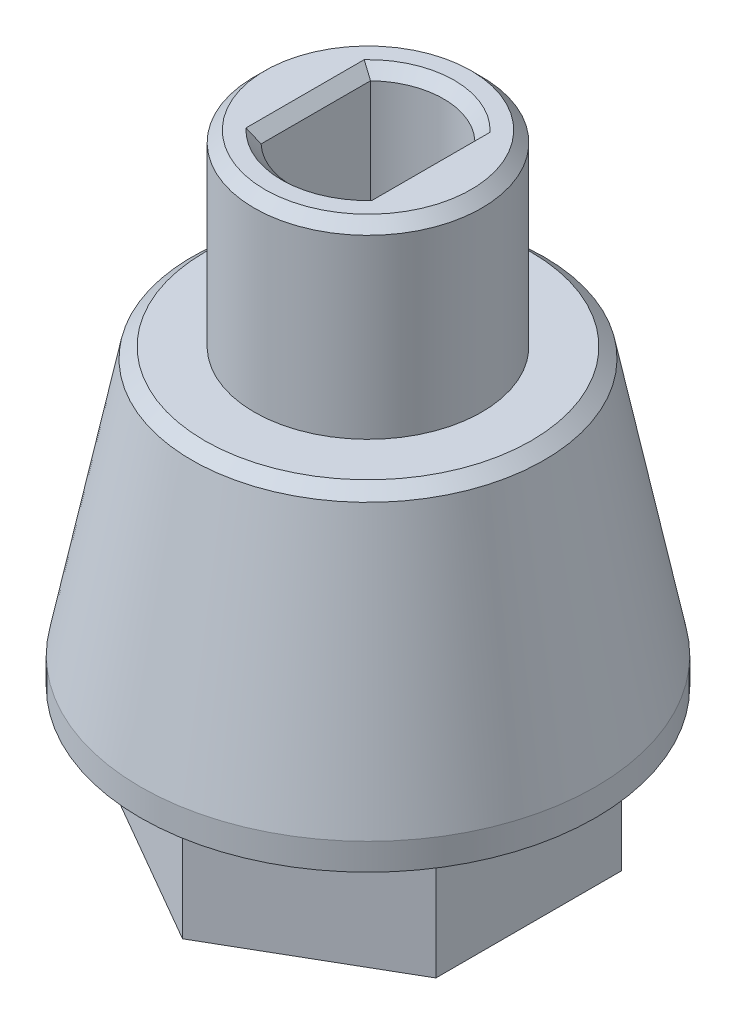
ISO-10303-21;
HEADER;
FILE_DESCRIPTION(('STEP AP214'),'2;1');
FILE_NAME('part.step','',(''),(''),'','','');
FILE_SCHEMA(('AUTOMOTIVE_DESIGN { 1 0 10303 214 1 1 1 1 }'));
ENDSEC;
DATA;
#1=APPLICATION_CONTEXT('core data for automotive mechanical design processes');
#2=APPLICATION_PROTOCOL_DEFINITION('international standard','automotive_design',2000,#1);
#3=PRODUCT_CONTEXT('',#1,'mechanical');
#4=PRODUCT('Part','Part','',(#3));
#5=PRODUCT_RELATED_PRODUCT_CATEGORY('part','',(#4));
#6=PRODUCT_DEFINITION_FORMATION('','',#4);
#7=PRODUCT_DEFINITION_CONTEXT('part definition',#1,'design');
#8=PRODUCT_DEFINITION('design','',#6,#7);
#9=PRODUCT_DEFINITION_SHAPE('','',#8);
#10=(LENGTH_UNIT() NAMED_UNIT(*) SI_UNIT(.MILLI.,.METRE.));
#11=(NAMED_UNIT(*) PLANE_ANGLE_UNIT() SI_UNIT($,.RADIAN.));
#12=(NAMED_UNIT(*) SI_UNIT($,.STERADIAN.) SOLID_ANGLE_UNIT());
#13=UNCERTAINTY_MEASURE_WITH_UNIT(LENGTH_MEASURE(1.E-05),#10,'distance_accuracy_value','');
#14=(GEOMETRIC_REPRESENTATION_CONTEXT(3) GLOBAL_UNCERTAINTY_ASSIGNED_CONTEXT((#13)) GLOBAL_UNIT_ASSIGNED_CONTEXT((#10,
#11,#12)) REPRESENTATION_CONTEXT('',''));
#15=CARTESIAN_POINT('',(0.,0.,0.));
#16=DIRECTION('',(0.,0.,1.));
#17=DIRECTION('',(1.,0.,0.));
#18=AXIS2_PLACEMENT_3D('',#15,#16,#17);
#19=CARTESIAN_POINT('',(0.,15.7,0.));
#20=DIRECTION('',(0.,1.,0.));
#21=DIRECTION('',(0.,0.,1.));
#22=AXIS2_PLACEMENT_3D('',#19,#20,#21);
#23=PLANE('',#22);
#24=CARTESIAN_POINT('',(0.,15.7,0.));
#25=DIRECTION('',(0.,1.,0.));
#26=DIRECTION('',(0.,0.,1.));
#27=AXIS2_PLACEMENT_3D('',#24,#25,#26);
#28=CIRCLE('',#27,6.09999999999999);
#29=CARTESIAN_POINT('',(0.,15.7,-6.09999999999999));
#30=VERTEX_POINT('',#29);
#31=EDGE_CURVE('E273',#30,#30,#28,.T.);
#32=ORIENTED_EDGE('',*,*,#31,.T.);
#33=EDGE_LOOP('',(#32));
#34=FACE_BOUND('',#33,.T.);
#35=CARTESIAN_POINT('',(0.,15.7,0.));
#36=DIRECTION('',(0.,1.,0.));
#37=DIRECTION('',(0.,0.,1.));
#38=AXIS2_PLACEMENT_3D('',#35,#36,#37);
#39=CIRCLE('',#38,4.25);
#40=CARTESIAN_POINT('',(0.,15.7,4.25));
#41=VERTEX_POINT('',#40);
#42=EDGE_CURVE('E159',#41,#41,#39,.T.);
#43=ORIENTED_EDGE('',*,*,#42,.F.);
#44=EDGE_LOOP('',(#43));
#45=FACE_BOUND('',#44,.T.);
#46=ADVANCED_FACE('F49',(#34,#45),#23,.T.);
#47=CARTESIAN_POINT('',(-6.00000000000002,4.7,-3.46410161513769));
#48=DIRECTION('',(0.500000000000005,0.,0.866025403784436));
#49=DIRECTION('',(0.866025403784436,0.,-0.500000000000005));
#50=AXIS2_PLACEMENT_3D('',#47,#48,#49);
#51=PLANE('',#50);
#52=DIRECTION('',(-0.866025403784436,0.,0.500000000000005));
#53=VECTOR('',#52,1.);
#54=CARTESIAN_POINT('',(-6.00000000000002,0.,-3.46410161513769));
#55=LINE('',#54,#53);
#56=CARTESIAN_POINT('',(0.,0.,-6.9282032302755));
#57=VERTEX_POINT('',#56);
#58=CARTESIAN_POINT('',(-6.00000000000002,0.,-3.46410161513769));
#59=VERTEX_POINT('',#58);
#60=EDGE_CURVE('E232',#57,#59,#55,.T.);
#61=ORIENTED_EDGE('',*,*,#60,.T.);
#62=DIRECTION('',(0.,-1.,0.));
#63=VECTOR('',#62,1.);
#64=CARTESIAN_POINT('',(-6.00000000000002,4.7,-3.46410161513769));
#65=LINE('',#64,#63);
#66=CARTESIAN_POINT('',(-6.00000000000002,4.7,-3.46410161513769));
#67=VERTEX_POINT('',#66);
#68=EDGE_CURVE('E269',#67,#59,#65,.T.);
#69=ORIENTED_EDGE('',*,*,#68,.F.);
#70=DIRECTION('',(-0.866025403784436,0.,0.500000000000005));
#71=VECTOR('',#70,1.);
#72=CARTESIAN_POINT('',(-6.00000000000002,4.7,-3.46410161513769));
#73=LINE('',#72,#71);
#74=CARTESIAN_POINT('',(0.,4.7,-6.9282032302755));
#75=VERTEX_POINT('',#74);
#76=EDGE_CURVE('E206',#75,#67,#73,.T.);
#77=ORIENTED_EDGE('',*,*,#76,.F.);
#78=DIRECTION('',(0.,-1.,0.));
#79=VECTOR('',#78,1.);
#80=CARTESIAN_POINT('',(0.,4.7,-6.9282032302755));
#81=LINE('',#80,#79);
#82=EDGE_CURVE('E231',#75,#57,#81,.T.);
#83=ORIENTED_EDGE('',*,*,#82,.T.);
#84=EDGE_LOOP('',(#61,#69,#77,#83));
#85=FACE_BOUND('',#84,.T.);
#86=ADVANCED_FACE('F366',(#85),#51,.F.);
#87=CARTESIAN_POINT('',(-5.99999999999997,4.7,3.46410161513778));
#88=DIRECTION('',(1.,0.,0.));
#89=DIRECTION('',(0.,0.,-1.));
#90=AXIS2_PLACEMENT_3D('',#87,#88,#89);
#91=PLANE('',#90);
#92=DIRECTION('',(0.,0.,1.));
#93=VECTOR('',#92,1.);
#94=CARTESIAN_POINT('',(-5.99999999999997,0.,3.46410161513778));
#95=LINE('',#94,#93);
#96=CARTESIAN_POINT('',(-5.99999999999997,0.,3.46410161513778));
#97=VERTEX_POINT('',#96);
#98=EDGE_CURVE('E236',#59,#97,#95,.T.);
#99=ORIENTED_EDGE('',*,*,#98,.T.);
#100=DIRECTION('',(0.,-1.,0.));
#101=VECTOR('',#100,1.);
#102=CARTESIAN_POINT('',(-5.99999999999997,4.7,3.46410161513778));
#103=LINE('',#102,#101);
#104=CARTESIAN_POINT('',(-5.99999999999997,4.7,3.46410161513778));
#105=VERTEX_POINT('',#104);
#106=EDGE_CURVE('E265',#105,#97,#103,.T.);
#107=ORIENTED_EDGE('',*,*,#106,.F.);
#108=DIRECTION('',(0.,0.,1.));
#109=VECTOR('',#108,1.);
#110=CARTESIAN_POINT('',(-5.99999999999997,4.7,3.46410161513778));
#111=LINE('',#110,#109);
#112=EDGE_CURVE('E210',#67,#105,#111,.T.);
#113=ORIENTED_EDGE('',*,*,#112,.F.);
#114=ORIENTED_EDGE('',*,*,#68,.T.);
#115=EDGE_LOOP('',(#99,#107,#113,#114));
#116=FACE_BOUND('',#115,.T.);
#117=ADVANCED_FACE('F372',(#116),#91,.F.);
#118=CARTESIAN_POINT('',(0.,4.7,6.9282032302755));
#119=DIRECTION('',(0.499999999999997,0.,-0.86602540378444));
#120=DIRECTION('',(-0.86602540378444,0.,-0.499999999999997));
#121=AXIS2_PLACEMENT_3D('',#118,#119,#120);
#122=PLANE('',#121);
#123=DIRECTION('',(0.86602540378444,0.,0.499999999999997));
#124=VECTOR('',#123,1.);
#125=CARTESIAN_POINT('',(0.,0.,6.9282032302755));
#126=LINE('',#125,#124);
#127=CARTESIAN_POINT('',(0.,0.,6.9282032302755));
#128=VERTEX_POINT('',#127);
#129=EDGE_CURVE('E239',#97,#128,#126,.T.);
#130=ORIENTED_EDGE('',*,*,#129,.T.);
#131=DIRECTION('',(0.,-1.,0.));
#132=VECTOR('',#131,1.);
#133=CARTESIAN_POINT('',(0.,4.7,6.9282032302755));
#134=LINE('',#133,#132);
#135=CARTESIAN_POINT('',(0.,4.7,6.9282032302755));
#136=VERTEX_POINT('',#135);
#137=EDGE_CURVE('E261',#136,#128,#134,.T.);
#138=ORIENTED_EDGE('',*,*,#137,.F.);
#139=DIRECTION('',(0.86602540378444,0.,0.499999999999997));
#140=VECTOR('',#139,1.);
#141=CARTESIAN_POINT('',(0.,4.7,6.9282032302755));
#142=LINE('',#141,#140);
#143=EDGE_CURVE('E215',#105,#136,#142,.T.);
#144=ORIENTED_EDGE('',*,*,#143,.F.);
#145=ORIENTED_EDGE('',*,*,#106,.T.);
#146=EDGE_LOOP('',(#130,#138,#144,#145));
#147=FACE_BOUND('',#146,.T.);
#148=ADVANCED_FACE('F408',(#147),#122,.F.);
#149=CARTESIAN_POINT('',(6.00000000000003,4.7,3.46410161513769));
#150=DIRECTION('',(-0.500000000000005,0.,-0.866025403784436));
#151=DIRECTION('',(-0.866025403784436,0.,0.500000000000005));
#152=AXIS2_PLACEMENT_3D('',#149,#150,#151);
#153=PLANE('',#152);
#154=DIRECTION('',(0.866025403784436,0.,-0.500000000000005));
#155=VECTOR('',#154,1.);
#156=CARTESIAN_POINT('',(6.00000000000003,0.,3.46410161513769));
#157=LINE('',#156,#155);
#158=CARTESIAN_POINT('',(6.00000000000003,0.,3.46410161513769));
#159=VERTEX_POINT('',#158);
#160=EDGE_CURVE('E242',#128,#159,#157,.T.);
#161=ORIENTED_EDGE('',*,*,#160,.T.);
#162=DIRECTION('',(0.,-1.,0.));
#163=VECTOR('',#162,1.);
#164=CARTESIAN_POINT('',(6.00000000000003,4.7,3.46410161513769));
#165=LINE('',#164,#163);
#166=CARTESIAN_POINT('',(6.00000000000003,4.7,3.46410161513769));
#167=VERTEX_POINT('',#166);
#168=EDGE_CURVE('E257',#167,#159,#165,.T.);
#169=ORIENTED_EDGE('',*,*,#168,.F.);
#170=DIRECTION('',(0.866025403784436,0.,-0.500000000000005));
#171=VECTOR('',#170,1.);
#172=CARTESIAN_POINT('',(6.00000000000003,4.7,3.46410161513769));
#173=LINE('',#172,#171);
#174=EDGE_CURVE('E219',#136,#167,#173,.T.);
#175=ORIENTED_EDGE('',*,*,#174,.F.);
#176=ORIENTED_EDGE('',*,*,#137,.T.);
#177=EDGE_LOOP('',(#161,#169,#175,#176));
#178=FACE_BOUND('',#177,.T.);
#179=ADVANCED_FACE('F404',(#178),#153,.F.);
#180=CARTESIAN_POINT('',(5.99999999999997,4.7,-3.46410161513778));
#181=DIRECTION('',(-1.,0.,0.));
#182=DIRECTION('',(0.,0.,1.));
#183=AXIS2_PLACEMENT_3D('',#180,#181,#182);
#184=PLANE('',#183);
#185=DIRECTION('',(0.,0.,-1.));
#186=VECTOR('',#185,1.);
#187=CARTESIAN_POINT('',(5.99999999999997,0.,-3.46410161513778));
#188=LINE('',#187,#186);
#189=CARTESIAN_POINT('',(5.99999999999997,0.,-3.46410161513778));
#190=VERTEX_POINT('',#189);
#191=EDGE_CURVE('E245',#159,#190,#188,.T.);
#192=ORIENTED_EDGE('',*,*,#191,.T.);
#193=DIRECTION('',(0.,-1.,0.));
#194=VECTOR('',#193,1.);
#195=CARTESIAN_POINT('',(5.99999999999997,4.7,-3.46410161513778));
#196=LINE('',#195,#194);
#197=CARTESIAN_POINT('',(5.99999999999997,4.7,-3.46410161513778));
#198=VERTEX_POINT('',#197);
#199=EDGE_CURVE('E253',#198,#190,#196,.T.);
#200=ORIENTED_EDGE('',*,*,#199,.F.);
#201=DIRECTION('',(0.,0.,-1.));
#202=VECTOR('',#201,1.);
#203=CARTESIAN_POINT('',(5.99999999999997,4.7,-3.46410161513778));
#204=LINE('',#203,#202);
#205=EDGE_CURVE('E223',#167,#198,#204,.T.);
#206=ORIENTED_EDGE('',*,*,#205,.F.);
#207=ORIENTED_EDGE('',*,*,#168,.T.);
#208=EDGE_LOOP('',(#192,#200,#206,#207));
#209=FACE_BOUND('',#208,.T.);
#210=ADVANCED_FACE('F400',(#209),#184,.F.);
#211=CARTESIAN_POINT('',(0.,4.7,-6.9282032302755));
#212=DIRECTION('',(-0.499999999999997,0.,0.86602540378444));
#213=DIRECTION('',(0.86602540378444,0.,0.499999999999997));
#214=AXIS2_PLACEMENT_3D('',#211,#212,#213);
#215=PLANE('',#214);
#216=DIRECTION('',(-0.86602540378444,0.,-0.499999999999997));
#217=VECTOR('',#216,1.);
#218=CARTESIAN_POINT('',(0.,0.,-6.9282032302755));
#219=LINE('',#218,#217);
#220=EDGE_CURVE('E211',#190,#57,#219,.T.);
#221=ORIENTED_EDGE('',*,*,#220,.T.);
#222=ORIENTED_EDGE('',*,*,#82,.F.);
#223=DIRECTION('',(-0.86602540378444,0.,-0.499999999999997));
#224=VECTOR('',#223,1.);
#225=CARTESIAN_POINT('',(0.,4.7,-6.9282032302755));
#226=LINE('',#225,#224);
#227=EDGE_CURVE('E227',#198,#75,#226,.T.);
#228=ORIENTED_EDGE('',*,*,#227,.F.);
#229=ORIENTED_EDGE('',*,*,#199,.T.);
#230=EDGE_LOOP('',(#221,#222,#228,#229));
#231=FACE_BOUND('',#230,.T.);
#232=ADVANCED_FACE('F396',(#231),#215,.F.);
#233=CARTESIAN_POINT('',(0.,0.,0.));
#234=DIRECTION('',(0.,-1.,0.));
#235=DIRECTION('',(0.,0.,-1.));
#236=AXIS2_PLACEMENT_3D('',#233,#234,#235);
#237=PLANE('',#236);
#238=CARTESIAN_POINT('',(0.,0.,0.));
#239=DIRECTION('',(0.,-1.,0.));
#240=DIRECTION('',(0.,0.,-1.));
#241=AXIS2_PLACEMENT_3D('',#238,#239,#240);
#242=CIRCLE('',#241,0.75);
#243=CARTESIAN_POINT('',(0.,0.,-0.75));
#244=VERTEX_POINT('',#243);
#245=EDGE_CURVE('E181',#244,#244,#242,.T.);
#246=ORIENTED_EDGE('',*,*,#245,.F.);
#247=EDGE_LOOP('',(#246));
#248=FACE_BOUND('',#247,.T.);
#249=ORIENTED_EDGE('',*,*,#60,.F.);
#250=ORIENTED_EDGE('',*,*,#220,.F.);
#251=ORIENTED_EDGE('',*,*,#191,.F.);
#252=ORIENTED_EDGE('',*,*,#160,.F.);
#253=ORIENTED_EDGE('',*,*,#129,.F.);
#254=ORIENTED_EDGE('',*,*,#98,.F.);
#255=EDGE_LOOP('',(#249,#250,#251,#252,#253,#254));
#256=FACE_BOUND('',#255,.T.);
#257=ADVANCED_FACE('F389',(#248,#256),#237,.T.);
#258=CARTESIAN_POINT('',(0.,4.7,0.));
#259=DIRECTION('',(0.,1.,0.));
#260=DIRECTION('',(0.,0.,1.));
#261=AXIS2_PLACEMENT_3D('',#258,#259,#260);
#262=PLANE('',#261);
#263=CARTESIAN_POINT('',(0.,4.7,0.));
#264=DIRECTION('',(0.,1.,0.));
#265=DIRECTION('',(0.,0.,1.));
#266=AXIS2_PLACEMENT_3D('',#263,#264,#265);
#267=CIRCLE('',#266,8.5);
#268=CARTESIAN_POINT('',(0.,4.7,8.5));
#269=VERTEX_POINT('',#268);
#270=EDGE_CURVE('E201',#269,#269,#267,.T.);
#271=ORIENTED_EDGE('',*,*,#270,.F.);
#272=EDGE_LOOP('',(#271));
#273=FACE_BOUND('',#272,.T.);
#274=ORIENTED_EDGE('',*,*,#227,.T.);
#275=ORIENTED_EDGE('',*,*,#76,.T.);
#276=ORIENTED_EDGE('',*,*,#112,.T.);
#277=ORIENTED_EDGE('',*,*,#143,.T.);
#278=ORIENTED_EDGE('',*,*,#174,.T.);
#279=ORIENTED_EDGE('',*,*,#205,.T.);
#280=EDGE_LOOP('',(#274,#275,#276,#277,#278,#279));
#281=FACE_BOUND('',#280,.T.);
#282=ADVANCED_FACE('F386',(#273,#281),#262,.F.);
#283=CARTESIAN_POINT('',(0.,5.7,0.));
#284=DIRECTION('',(0.,-1.,0.));
#285=DIRECTION('',(0.,0.,-1.));
#286=AXIS2_PLACEMENT_3D('',#283,#284,#285);
#287=CYLINDRICAL_SURFACE('',#286,8.5);
#288=CARTESIAN_POINT('',(0.,5.7,0.));
#289=DIRECTION('',(0.,-1.,0.));
#290=DIRECTION('',(0.,0.,-1.));
#291=AXIS2_PLACEMENT_3D('',#288,#289,#290);
#292=CIRCLE('',#291,8.5);
#293=CARTESIAN_POINT('',(0.,5.7,-8.5));
#294=VERTEX_POINT('',#293);
#295=EDGE_CURVE('E205',#294,#294,#292,.F.);
#296=ORIENTED_EDGE('',*,*,#295,.F.);
#297=EDGE_LOOP('',(#296));
#298=FACE_BOUND('',#297,.T.);
#299=ORIENTED_EDGE('',*,*,#270,.T.);
#300=EDGE_LOOP('',(#299));
#301=FACE_BOUND('',#300,.T.);
#302=ADVANCED_FACE('F384',(#298,#301),#287,.T.);
#303=CARTESIAN_POINT('',(0.,15.7,0.));
#304=DIRECTION('',(0.,-1.,0.));
#305=DIRECTION('',(0.,0.,-1.));
#306=AXIS2_PLACEMENT_3D('',#303,#304,#305);
#307=CONICAL_SURFACE('',#306,6.5,0.197395559849881);
#308=CARTESIAN_POINT('',(0.,15.3077677297236,0.));
#309=DIRECTION('',(0.,1.,0.));
#310=DIRECTION('',(0.,0.,1.));
#311=AXIS2_PLACEMENT_3D('',#308,#309,#310);
#312=CIRCLE('',#311,6.57844645405527);
#313=CARTESIAN_POINT('',(0.,15.3077677297236,-6.57844645405527));
#314=VERTEX_POINT('',#313);
#315=EDGE_CURVE('E282',#314,#314,#312,.F.);
#316=ORIENTED_EDGE('',*,*,#315,.T.);
#317=EDGE_LOOP('',(#316));
#318=FACE_BOUND('',#317,.T.);
#319=ORIENTED_EDGE('',*,*,#295,.T.);
#320=EDGE_LOOP('',(#319));
#321=FACE_BOUND('',#320,.T.);
#322=ADVANCED_FACE('F380',(#318,#321),#307,.T.);
#323=CARTESIAN_POINT('',(0.,22.7,0.));
#324=DIRECTION('',(0.,1.,0.));
#325=DIRECTION('',(0.,0.,1.));
#326=AXIS2_PLACEMENT_3D('',#323,#324,#325);
#327=PLANE('',#326);
#328=CARTESIAN_POINT('',(0.,22.7,0.));
#329=DIRECTION('',(0.,1.,0.));
#330=DIRECTION('',(0.,0.,1.));
#331=AXIS2_PLACEMENT_3D('',#328,#329,#330);
#332=CIRCLE('',#331,3.22500000000001);
#333=CARTESIAN_POINT('',(2.35000000000001,22.7,2.20864777635548));
#334=VERTEX_POINT('',#333);
#335=CARTESIAN_POINT('',(-2.35000000000001,22.7,2.20864777635548));
#336=VERTEX_POINT('',#335);
#337=EDGE_CURVE('E293',#334,#336,#332,.F.);
#338=ORIENTED_EDGE('',*,*,#337,.T.);
#339=DIRECTION('',(0.,0.,-1.));
#340=VECTOR('',#339,1.);
#341=CARTESIAN_POINT('',(-2.35000000000001,22.7,0.));
#342=LINE('',#341,#340);
#343=CARTESIAN_POINT('',(-2.35000000000001,22.7,-2.20864777635548));
#344=VERTEX_POINT('',#343);
#345=EDGE_CURVE('E302',#336,#344,#342,.T.);
#346=ORIENTED_EDGE('',*,*,#345,.T.);
#347=CARTESIAN_POINT('',(0.,22.7,0.));
#348=DIRECTION('',(0.,1.,0.));
#349=DIRECTION('',(0.,0.,1.));
#350=AXIS2_PLACEMENT_3D('',#347,#348,#349);
#351=CIRCLE('',#350,3.22500000000001);
#352=CARTESIAN_POINT('',(2.35000000000001,22.7,-2.20864777635548));
#353=VERTEX_POINT('',#352);
#354=EDGE_CURVE('E299',#344,#353,#351,.F.);
#355=ORIENTED_EDGE('',*,*,#354,.T.);
#356=DIRECTION('',(0.,0.,1.));
#357=VECTOR('',#356,1.);
#358=CARTESIAN_POINT('',(2.35000000000001,22.7,0.));
#359=LINE('',#358,#357);
#360=EDGE_CURVE('E296',#353,#334,#359,.T.);
#361=ORIENTED_EDGE('',*,*,#360,.T.);
#362=EDGE_LOOP('',(#338,#346,#355,#361));
#363=FACE_BOUND('',#362,.T.);
#364=CARTESIAN_POINT('',(0.,22.7,0.));
#365=DIRECTION('',(0.,1.,0.));
#366=DIRECTION('',(0.,0.,1.));
#367=AXIS2_PLACEMENT_3D('',#364,#365,#366);
#368=CIRCLE('',#367,3.85);
#369=CARTESIAN_POINT('',(0.,22.7,3.85));
#370=VERTEX_POINT('',#369);
#371=EDGE_CURVE('E289',#370,#370,#368,.T.);
#372=ORIENTED_EDGE('',*,*,#371,.T.);
#373=EDGE_LOOP('',(#372));
#374=FACE_BOUND('',#373,.T.);
#375=ADVANCED_FACE('F383',(#363,#374),#327,.T.);
#376=CARTESIAN_POINT('',(0.,22.7,0.));
#377=DIRECTION('',(0.,-1.,0.));
#378=DIRECTION('',(0.,0.,-1.));
#379=AXIS2_PLACEMENT_3D('',#376,#377,#378);
#380=CYLINDRICAL_SURFACE('',#379,4.25);
#381=CARTESIAN_POINT('',(0.,22.3,0.));
#382=DIRECTION('',(0.,1.,0.));
#383=DIRECTION('',(0.,0.,1.));
#384=AXIS2_PLACEMENT_3D('',#381,#382,#383);
#385=CIRCLE('',#384,4.25);
#386=CARTESIAN_POINT('',(0.,22.3,4.25));
#387=VERTEX_POINT('',#386);
#388=EDGE_CURVE('E12',#387,#387,#385,.F.);
#389=ORIENTED_EDGE('',*,*,#388,.T.);
#390=EDGE_LOOP('',(#389));
#391=FACE_BOUND('',#390,.T.);
#392=ORIENTED_EDGE('',*,*,#42,.T.);
#393=EDGE_LOOP('',(#392));
#394=FACE_BOUND('',#393,.T.);
#395=ADVANCED_FACE('F378',(#391,#394),#380,.T.);
#396=CARTESIAN_POINT('',(0.,22.7,0.));
#397=DIRECTION('',(0.,-1.,0.));
#398=DIRECTION('',(0.,0.,-1.));
#399=AXIS2_PLACEMENT_3D('',#396,#397,#398);
#400=CYLINDRICAL_SURFACE('',#399,2.825);
#401=DIRECTION('',(0.,-1.,0.));
#402=VECTOR('',#401,1.);
#403=CARTESIAN_POINT('',(1.95,22.7,-2.04404623235386));
#404=LINE('',#403,#402);
#405=CARTESIAN_POINT('',(1.95,22.3,-2.04404623235386));
#406=VERTEX_POINT('',#405);
#407=CARTESIAN_POINT('',(1.95,14.7,-2.04404623235386));
#408=VERTEX_POINT('',#407);
#409=EDGE_CURVE('E190',#406,#408,#404,.T.);
#410=ORIENTED_EDGE('',*,*,#409,.F.);
#411=CARTESIAN_POINT('',(0.,22.3,0.));
#412=DIRECTION('',(0.,1.,0.));
#413=DIRECTION('',(0.,0.,1.));
#414=AXIS2_PLACEMENT_3D('',#411,#412,#413);
#415=CIRCLE('',#414,2.825);
#416=CARTESIAN_POINT('',(-1.95,22.3,-2.04404623235386));
#417=VERTEX_POINT('',#416);
#418=EDGE_CURVE('E154',#406,#417,#415,.T.);
#419=ORIENTED_EDGE('',*,*,#418,.T.);
#420=DIRECTION('',(0.,-1.,0.));
#421=VECTOR('',#420,1.);
#422=CARTESIAN_POINT('',(-1.95,22.7,-2.04404623235386));
#423=LINE('',#422,#421);
#424=CARTESIAN_POINT('',(-1.95,14.7,-2.04404623235386));
#425=VERTEX_POINT('',#424);
#426=EDGE_CURVE('E147',#417,#425,#423,.T.);
#427=ORIENTED_EDGE('',*,*,#426,.T.);
#428=CARTESIAN_POINT('',(0.,14.7,0.));
#429=DIRECTION('',(0.,1.,0.));
#430=DIRECTION('',(0.,0.,1.));
#431=AXIS2_PLACEMENT_3D('',#428,#429,#430);
#432=CIRCLE('',#431,2.825);
#433=EDGE_CURVE('E151',#408,#425,#432,.T.);
#434=ORIENTED_EDGE('',*,*,#433,.F.);
#435=EDGE_LOOP('',(#410,#419,#427,#434));
#436=FACE_BOUND('',#435,.T.);
#437=ADVANCED_FACE('F149',(#436),#400,.F.);
#438=CARTESIAN_POINT('',(-1.95,22.7,-2.04404623235386));
#439=DIRECTION('',(1.,0.,0.));
#440=DIRECTION('',(0.,0.,-1.));
#441=AXIS2_PLACEMENT_3D('',#438,#439,#440);
#442=PLANE('',#441);
#443=ORIENTED_EDGE('',*,*,#426,.F.);
#444=DIRECTION('',(0.,0.,1.));
#445=VECTOR('',#444,1.);
#446=CARTESIAN_POINT('',(-1.95,22.3,-2.04404623235386));
#447=LINE('',#446,#445);
#448=CARTESIAN_POINT('',(-1.95,22.3,2.04404623235386));
#449=VERTEX_POINT('',#448);
#450=EDGE_CURVE('E286',#417,#449,#447,.T.);
#451=ORIENTED_EDGE('',*,*,#450,.T.);
#452=DIRECTION('',(0.,-1.,0.));
#453=VECTOR('',#452,1.);
#454=CARTESIAN_POINT('',(-1.95,22.7,2.04404623235386));
#455=LINE('',#454,#453);
#456=CARTESIAN_POINT('',(-1.95,14.7,2.04404623235386));
#457=VERTEX_POINT('',#456);
#458=EDGE_CURVE('E160',#449,#457,#455,.T.);
#459=ORIENTED_EDGE('',*,*,#458,.T.);
#460=DIRECTION('',(0.,0.,1.));
#461=VECTOR('',#460,1.);
#462=CARTESIAN_POINT('',(-1.95,14.7,-2.04404623235386));
#463=LINE('',#462,#461);
#464=EDGE_CURVE('E163',#425,#457,#463,.T.);
#465=ORIENTED_EDGE('',*,*,#464,.F.);
#466=EDGE_LOOP('',(#443,#451,#459,#465));
#467=FACE_BOUND('',#466,.T.);
#468=ADVANCED_FACE('F164',(#467),#442,.T.);
#469=CARTESIAN_POINT('',(0.,22.7,0.));
#470=DIRECTION('',(0.,-1.,0.));
#471=DIRECTION('',(0.,0.,-1.));
#472=AXIS2_PLACEMENT_3D('',#469,#470,#471);
#473=CYLINDRICAL_SURFACE('',#472,2.825);
#474=ORIENTED_EDGE('',*,*,#458,.F.);
#475=CARTESIAN_POINT('',(0.,22.3,0.));
#476=DIRECTION('',(0.,1.,0.));
#477=DIRECTION('',(0.,0.,1.));
#478=AXIS2_PLACEMENT_3D('',#475,#476,#477);
#479=CIRCLE('',#478,2.825);
#480=CARTESIAN_POINT('',(1.95,22.3,2.04404623235386));
#481=VERTEX_POINT('',#480);
#482=EDGE_CURVE('E65',#449,#481,#479,.T.);
#483=ORIENTED_EDGE('',*,*,#482,.T.);
#484=DIRECTION('',(0.,-1.,0.));
#485=VECTOR('',#484,1.);
#486=CARTESIAN_POINT('',(1.95,22.7,2.04404623235386));
#487=LINE('',#486,#485);
#488=CARTESIAN_POINT('',(1.95,14.7,2.04404623235386));
#489=VERTEX_POINT('',#488);
#490=EDGE_CURVE('E193',#481,#489,#487,.T.);
#491=ORIENTED_EDGE('',*,*,#490,.T.);
#492=CARTESIAN_POINT('',(0.,14.7,0.));
#493=DIRECTION('',(0.,1.,0.));
#494=DIRECTION('',(0.,0.,1.));
#495=AXIS2_PLACEMENT_3D('',#492,#493,#494);
#496=CIRCLE('',#495,2.825);
#497=EDGE_CURVE('E169',#457,#489,#496,.T.);
#498=ORIENTED_EDGE('',*,*,#497,.F.);
#499=EDGE_LOOP('',(#474,#483,#491,#498));
#500=FACE_BOUND('',#499,.T.);
#501=ADVANCED_FACE('F494',(#500),#473,.F.);
#502=CARTESIAN_POINT('',(1.95,22.7,-2.04404623235386));
#503=DIRECTION('',(-1.,0.,0.));
#504=DIRECTION('',(0.,0.,1.));
#505=AXIS2_PLACEMENT_3D('',#502,#503,#504);
#506=PLANE('',#505);
#507=ORIENTED_EDGE('',*,*,#490,.F.);
#508=DIRECTION('',(0.,0.,-1.));
#509=VECTOR('',#508,1.);
#510=CARTESIAN_POINT('',(1.95,22.3,-2.04404623235386));
#511=LINE('',#510,#509);
#512=EDGE_CURVE('E79',#481,#406,#511,.T.);
#513=ORIENTED_EDGE('',*,*,#512,.T.);
#514=ORIENTED_EDGE('',*,*,#409,.T.);
#515=DIRECTION('',(0.,0.,-1.));
#516=VECTOR('',#515,1.);
#517=CARTESIAN_POINT('',(1.95,14.7,2.04404623235386));
#518=LINE('',#517,#516);
#519=EDGE_CURVE('E173',#489,#408,#518,.T.);
#520=ORIENTED_EDGE('',*,*,#519,.F.);
#521=EDGE_LOOP('',(#507,#513,#514,#520));
#522=FACE_BOUND('',#521,.T.);
#523=ADVANCED_FACE('F362',(#522),#506,.T.);
#524=CARTESIAN_POINT('',(0.,15.7,0.));
#525=DIRECTION('',(0.,-1.,0.));
#526=DIRECTION('',(0.,0.,-1.));
#527=AXIS2_PLACEMENT_3D('',#524,#525,#526);
#528=CONICAL_SURFACE('',#527,6.09999999999999,0.884095943322396);
#529=CARTESIAN_POINT('',(0.,15.3077677297236,-6.57844645405527));
#530=CARTESIAN_POINT('',(0.,15.311853482539,-6.57346263682552));
#531=CARTESIAN_POINT('',(0.,15.3159392353544,-6.56847881959578));
#532=CARTESIAN_POINT('',(0.,15.3241107409851,-6.5585111851363));
#533=CARTESIAN_POINT('',(0.,15.3281964938005,-6.55352736790655));
#534=CARTESIAN_POINT('',(0.,15.3363679994313,-6.54355973344707));
#535=CARTESIAN_POINT('',(0.,15.3404537522467,-6.53857591621733));
#536=CARTESIAN_POINT('',(0.,15.3486252578774,-6.52860828175784));
#537=CARTESIAN_POINT('',(0.,15.3527110106928,-6.5236244645281));
#538=CARTESIAN_POINT('',(0.,15.3608825163236,-6.51365683006862));
#539=CARTESIAN_POINT('',(0.,15.3649682691389,-6.50867301283887));
#540=CARTESIAN_POINT('',(0.,15.3731397747697,-6.49870537837939));
#541=CARTESIAN_POINT('',(0.,15.3772255275851,-6.49372156114964));
#542=CARTESIAN_POINT('',(0.,15.3853970332158,-6.48375392669016));
#543=CARTESIAN_POINT('',(0.,15.3894827860312,-6.47877010946042));
#544=CARTESIAN_POINT('',(0.,15.397654291662,-6.46880247500093));
#545=CARTESIAN_POINT('',(0.,15.4017400444773,-6.46381865777119));
#546=CARTESIAN_POINT('',(0.,15.4099115501081,-6.45385102331171));
#547=CARTESIAN_POINT('',(0.,15.4139973029235,-6.44886720608196));
#548=CARTESIAN_POINT('',(0.,15.4221688085542,-6.43889957162248));
#549=CARTESIAN_POINT('',(0.,15.4262545613696,-6.43391575439274));
#550=CARTESIAN_POINT('',(0.,15.4344260670004,-6.42394811993325));
#551=CARTESIAN_POINT('',(0.,15.4385118198158,-6.41896430270351));
#552=CARTESIAN_POINT('',(0.,15.4466833254465,-6.40899666824402));
#553=CARTESIAN_POINT('',(0.,15.4507690782619,-6.40401285101428));
#554=CARTESIAN_POINT('',(0.,15.4589405838926,-6.3940452165548));
#555=CARTESIAN_POINT('',(0.,15.463026336708,-6.38906139932505));
#556=CARTESIAN_POINT('',(0.,15.4711978423388,-6.37909376486557));
#557=CARTESIAN_POINT('',(0.,15.4752835951542,-6.37410994763583));
#558=CARTESIAN_POINT('',(0.,15.4834551007849,-6.36414231317634));
#559=CARTESIAN_POINT('',(0.,15.4875408536003,-6.3591584959466));
#560=CARTESIAN_POINT('',(0.,15.4957123592311,-6.34919086148712));
#561=CARTESIAN_POINT('',(0.,15.4997981120464,-6.34420704425737));
#562=CARTESIAN_POINT('',(0.,15.5079696176772,-6.33423940979789));
#563=CARTESIAN_POINT('',(0.,15.5120553704926,-6.32925559256815));
#564=CARTESIAN_POINT('',(0.,15.5202268761233,-6.31928795810866));
#565=CARTESIAN_POINT('',(0.,15.5243126289387,-6.31430414087892));
#566=CARTESIAN_POINT('',(0.,15.5324841345695,-6.30433650641943));
#567=CARTESIAN_POINT('',(0.,15.5365698873848,-6.29935268918969));
#568=CARTESIAN_POINT('',(0.,15.5447413930156,-6.28938505473021));
#569=CARTESIAN_POINT('',(0.,15.548827145831,-6.28440123750046));
#570=CARTESIAN_POINT('',(0.,15.5569986514617,-6.27443360304098));
#571=CARTESIAN_POINT('',(0.,15.5610844042771,-6.26944978581124));
#572=CARTESIAN_POINT('',(0.,15.5692559099079,-6.25948215135175));
#573=CARTESIAN_POINT('',(0.,15.5733416627233,-6.25449833412201));
#574=CARTESIAN_POINT('',(0.,15.581513168354,-6.24453069966252));
#575=CARTESIAN_POINT('',(0.,15.5855989211694,-6.23954688243278));
#576=CARTESIAN_POINT('',(0.,15.5937704268001,-6.2295792479733));
#577=CARTESIAN_POINT('',(0.,15.5978561796155,-6.22459543074355));
#578=CARTESIAN_POINT('',(0.,15.6060276852463,-6.21462779628407));
#579=CARTESIAN_POINT('',(0.,15.6101134380617,-6.20964397905433));
#580=CARTESIAN_POINT('',(0.,15.6182849436924,-6.19967634459484));
#581=CARTESIAN_POINT('',(0.,15.6223706965078,-6.1946925273651));
#582=CARTESIAN_POINT('',(0.,15.6305422021386,-6.18472489290561));
#583=CARTESIAN_POINT('',(0.,15.6346279549539,-6.17974107567587));
#584=CARTESIAN_POINT('',(0.,15.6427994605847,-6.16977344121639));
#585=CARTESIAN_POINT('',(0.,15.6468852134001,-6.16478962398664));
#586=CARTESIAN_POINT('',(0.,15.6550567190308,-6.15482198952716));
#587=CARTESIAN_POINT('',(0.,15.6591424718462,-6.14983817229742));
#588=CARTESIAN_POINT('',(0.,15.667313977477,-6.13987053783793));
#589=CARTESIAN_POINT('',(0.,15.6713997302923,-6.13488672060819));
#590=CARTESIAN_POINT('',(0.,15.6795712359231,-6.12491908614871));
#591=CARTESIAN_POINT('',(0.,15.6836569887385,-6.11993526891896));
#592=CARTESIAN_POINT('',(0.,15.6918284943692,-6.10996763445948));
#593=CARTESIAN_POINT('',(0.,15.6959142471846,-6.10498381722974));
#594=CARTESIAN_POINT('',(0.,15.7,-6.09999999999999));
#595=B_SPLINE_CURVE_WITH_KNOTS('',3,(#529,#530,#531,#532,#533,#534,#535,#536,#537,#538,#539,
#540,#541,#542,#543,#544,#545,#546,#547,#548,#549,#550,#551,#552,#553,#554,#555,#556,#557,#558,
#559,#560,#561,#562,#563,#564,#565,#566,#567,#568,#569,#570,#571,#572,#573,#574,#575,#576,#577,
#578,#579,#580,#581,#582,#583,#584,#585,#586,#587,#588,#589,#590,#591,#592,#593,#594),
.UNSPECIFIED.,.F.,.F.,(4,2,2,2,2,2,2,2,2,2,2,2,2,2,2,2,2,2,2,2,2,2,2,2,2,2,2,2,2,2,2,2,4),(0.,
0.0193335535334486,0.0386671070668954,0.0580006606003429,0.0773342141337898,0.0966677676672384,
0.116001321200686,0.135334874734133,0.15466842826758,0.174001981801028,0.193335535334476,
0.212669088867922,0.23200264240137,0.251336195934818,0.270669749468265,0.290003303001712,
0.30933685653516,0.328670410068607,0.348003963602055,0.367337517135503,0.386671070668949,
0.406004624202397,0.425338177735845,0.444671731269292,0.464005284802739,0.483338838336187,
0.502672391869635,0.522005945403081,0.541339498936529,0.560673052469977,0.580006606003423,
0.599340159536872,0.61867371307032),.UNSPECIFIED.);
#596=EDGE_CURVE('BSEAM354',#314,#30,#595,.T.);
#597=ORIENTED_EDGE('',*,*,#315,.F.);
#598=ORIENTED_EDGE('',*,*,#31,.F.);
#599=ORIENTED_EDGE('',*,*,#596,.T.);
#600=ORIENTED_EDGE('',*,*,#596,.F.);
#601=EDGE_LOOP('',(#597,#599,#598,#600));
#602=FACE_BOUND('',#601,.T.);
#603=ADVANCED_FACE('F354',(#602),#528,.T.);
#604=CARTESIAN_POINT('',(1.95,22.3,-2.04404623235386));
#605=DIRECTION('',(0.707106781186549,-0.707106781186546,0.));
#606=DIRECTION('',(0.,0.,-1.));
#607=AXIS2_PLACEMENT_3D('',#604,#605,#606);
#608=PLANE('',#607);
#609=CARTESIAN_POINT('',(2.35000000000001,22.7,2.20864777635548));
#610=CARTESIAN_POINT('',(2.2831320979696,22.6331320979696,2.18219286052062));
#611=CARTESIAN_POINT('',(2.21636487284457,22.5663648728446,2.15524863258625));
#612=CARTESIAN_POINT('',(2.08303153879357,22.4330315387936,2.10038145474038));
#613=CARTESIAN_POINT('',(2.01646543058527,22.3664654305853,2.07245850134087));
#614=CARTESIAN_POINT('',(1.95,22.3,2.04404623235386));
#615=B_SPLINE_CURVE_WITH_KNOTS('',3,(#609,#610,#611,#612,#613,#614),.UNSPECIFIED.,.F.,.F.,(4,2,
4),(0.,0.294576721902716,0.589154493730386),.UNSPECIFIED.);
#616=EDGE_CURVE('E340',#334,#481,#615,.T.);
#617=ORIENTED_EDGE('',*,*,#616,.F.);
#618=ORIENTED_EDGE('',*,*,#360,.F.);
#619=CARTESIAN_POINT('',(2.35000000000001,22.7,-2.20864777635548));
#620=CARTESIAN_POINT('',(2.2831320979696,22.6331320979696,-2.18219286052062));
#621=CARTESIAN_POINT('',(2.21636487284457,22.5663648728446,-2.15524863258625));
#622=CARTESIAN_POINT('',(2.08303153879357,22.4330315387936,-2.10038145474038));
#623=CARTESIAN_POINT('',(2.01646543058527,22.3664654305853,-2.07245850134087));
#624=CARTESIAN_POINT('',(1.95,22.3,-2.04404623235386));
#625=B_SPLINE_CURVE_WITH_KNOTS('',3,(#619,#620,#621,#622,#623,#624),.UNSPECIFIED.,.F.,.F.,(4,2,
4),(0.,0.294576721902716,0.589154493730386),.UNSPECIFIED.);
#626=EDGE_CURVE('E54',#406,#353,#625,.F.);
#627=ORIENTED_EDGE('',*,*,#626,.F.);
#628=ORIENTED_EDGE('',*,*,#512,.F.);
#629=EDGE_LOOP('',(#617,#618,#627,#628));
#630=FACE_BOUND('',#629,.T.);
#631=ADVANCED_FACE('F348',(#630),#608,.F.);
#632=CARTESIAN_POINT('',(0.,22.3,0.));
#633=DIRECTION('',(0.,1.,0.));
#634=DIRECTION('',(0.,0.,1.));
#635=AXIS2_PLACEMENT_3D('',#632,#633,#634);
#636=CONICAL_SURFACE('',#635,2.825,0.785398163397446);
#637=ORIENTED_EDGE('',*,*,#626,.T.);
#638=ORIENTED_EDGE('',*,*,#354,.F.);
#639=CARTESIAN_POINT('',(-2.35000000000001,22.7,-2.20864777635548));
#640=CARTESIAN_POINT('',(-2.2831320979696,22.6331320979696,-2.18219286052062));
#641=CARTESIAN_POINT('',(-2.21636487284457,22.5663648728446,-2.15524863258625));
#642=CARTESIAN_POINT('',(-2.08303153879357,22.4330315387936,-2.10038145474038));
#643=CARTESIAN_POINT('',(-2.01646543058527,22.3664654305853,-2.07245850134087));
#644=CARTESIAN_POINT('',(-1.95,22.3,-2.04404623235386));
#645=B_SPLINE_CURVE_WITH_KNOTS('',3,(#639,#640,#641,#642,#643,#644),.UNSPECIFIED.,.F.,.F.,(4,2,
4),(0.,0.294576721902716,0.589154493730386),.UNSPECIFIED.);
#646=EDGE_CURVE('E320',#417,#344,#645,.F.);
#647=ORIENTED_EDGE('',*,*,#646,.F.);
#648=ORIENTED_EDGE('',*,*,#418,.F.);
#649=EDGE_LOOP('',(#637,#638,#647,#648));
#650=FACE_BOUND('',#649,.T.);
#651=ADVANCED_FACE('F336',(#650),#636,.F.);
#652=CARTESIAN_POINT('',(0.,22.3,0.));
#653=DIRECTION('',(0.,1.,0.));
#654=DIRECTION('',(0.,0.,1.));
#655=AXIS2_PLACEMENT_3D('',#652,#653,#654);
#656=CONICAL_SURFACE('',#655,2.825,0.785398163397446);
#657=ORIENTED_EDGE('',*,*,#616,.T.);
#658=ORIENTED_EDGE('',*,*,#482,.F.);
#659=CARTESIAN_POINT('',(-1.95,22.3,2.04404623235386));
#660=CARTESIAN_POINT('',(-2.01646543058527,22.3664654305853,2.07245850134087));
#661=CARTESIAN_POINT('',(-2.08303153879357,22.4330315387936,2.10038145474038));
#662=CARTESIAN_POINT('',(-2.21636487284457,22.5663648728446,2.15524863258625));
#663=CARTESIAN_POINT('',(-2.2831320979696,22.6331320979696,2.18219286052062));
#664=CARTESIAN_POINT('',(-2.35000000000001,22.7,2.20864777635548));
#665=B_SPLINE_CURVE_WITH_KNOTS('',3,(#659,#660,#661,#662,#663,#664),.UNSPECIFIED.,.F.,.F.,(4,2,
4),(0.,0.29457777182767,0.589154493730386),.UNSPECIFIED.);
#666=EDGE_CURVE('E186',#336,#449,#665,.F.);
#667=ORIENTED_EDGE('',*,*,#666,.F.);
#668=ORIENTED_EDGE('',*,*,#337,.F.);
#669=EDGE_LOOP('',(#657,#658,#667,#668));
#670=FACE_BOUND('',#669,.T.);
#671=ADVANCED_FACE('F330',(#670),#656,.F.);
#672=CARTESIAN_POINT('',(-1.95,22.3,-2.04404623235386));
#673=DIRECTION('',(-0.707106781186549,-0.707106781186546,0.));
#674=DIRECTION('',(0.,0.,1.));
#675=AXIS2_PLACEMENT_3D('',#672,#673,#674);
#676=PLANE('',#675);
#677=ORIENTED_EDGE('',*,*,#646,.T.);
#678=ORIENTED_EDGE('',*,*,#345,.F.);
#679=ORIENTED_EDGE('',*,*,#666,.T.);
#680=ORIENTED_EDGE('',*,*,#450,.F.);
#681=EDGE_LOOP('',(#677,#678,#679,#680));
#682=FACE_BOUND('',#681,.T.);
#683=ADVANCED_FACE('F326',(#682),#676,.F.);
#684=CARTESIAN_POINT('',(0.,22.7,0.));
#685=DIRECTION('',(0.,-1.,0.));
#686=DIRECTION('',(0.,0.,-1.));
#687=AXIS2_PLACEMENT_3D('',#684,#685,#686);
#688=CONICAL_SURFACE('',#687,3.85,0.785398163397444);
#689=ORIENTED_EDGE('',*,*,#388,.F.);
#690=EDGE_LOOP('',(#689));
#691=FACE_BOUND('',#690,.T.);
#692=ORIENTED_EDGE('',*,*,#371,.F.);
#693=EDGE_LOOP('',(#692));
#694=FACE_BOUND('',#693,.T.);
#695=ADVANCED_FACE('F52',(#691,#694),#688,.T.);
#696=CARTESIAN_POINT('',(0.,7.,0.));
#697=DIRECTION('',(0.,-1.,0.));
#698=DIRECTION('',(0.,0.,-1.));
#699=AXIS2_PLACEMENT_3D('',#696,#697,#698);
#700=CYLINDRICAL_SURFACE('',#699,0.75);
#701=CARTESIAN_POINT('',(0.,7.,0.));
#702=DIRECTION('',(0.,-1.,0.));
#703=DIRECTION('',(0.,0.,-1.));
#704=AXIS2_PLACEMENT_3D('',#701,#702,#703);
#705=CIRCLE('',#704,0.75);
#706=CARTESIAN_POINT('',(0.,7.,-0.75));
#707=VERTEX_POINT('',#706);
#708=EDGE_CURVE('E182',#707,#707,#705,.T.);
#709=ORIENTED_EDGE('',*,*,#708,.F.);
#710=EDGE_LOOP('',(#709));
#711=FACE_BOUND('',#710,.T.);
#712=ORIENTED_EDGE('',*,*,#245,.T.);
#713=EDGE_LOOP('',(#712));
#714=FACE_BOUND('',#713,.T.);
#715=ADVANCED_FACE('F548',(#711,#714),#700,.F.);
#716=CARTESIAN_POINT('',(0.,7.,0.));
#717=DIRECTION('',(0.,-1.,0.));
#718=DIRECTION('',(0.,0.,-1.));
#719=AXIS2_PLACEMENT_3D('',#716,#717,#718);
#720=PLANE('',#719);
#721=ORIENTED_EDGE('',*,*,#708,.T.);
#722=EDGE_LOOP('',(#721));
#723=FACE_BOUND('',#722,.T.);
#724=ADVANCED_FACE('F558',(#723),#720,.T.);
#725=CARTESIAN_POINT('',(0.,14.7,0.));
#726=DIRECTION('',(0.,1.,0.));
#727=DIRECTION('',(0.,0.,1.));
#728=AXIS2_PLACEMENT_3D('',#725,#726,#727);
#729=PLANE('',#728);
#730=ORIENTED_EDGE('',*,*,#433,.T.);
#731=ORIENTED_EDGE('',*,*,#464,.T.);
#732=ORIENTED_EDGE('',*,*,#497,.T.);
#733=ORIENTED_EDGE('',*,*,#519,.T.);
#734=EDGE_LOOP('',(#730,#731,#732,#733));
#735=FACE_BOUND('',#734,.T.);
#736=ADVANCED_FACE('F171',(#735),#729,.T.);
#737=CLOSED_SHELL('',(#46,#86,#117,#148,#179,#210,#232,#257,#282,#302,#322,#375,#395,#437,#468,
#501,#523,#603,#631,#651,#671,#683,#695,#715,#724,#736));
#738=MANIFOLD_SOLID_BREP('B2',#737);
#739=ADVANCED_BREP_SHAPE_REPRESENTATION('',(#18,#738),#14);
#740=SHAPE_DEFINITION_REPRESENTATION(#9,#739);
ENDSEC;
END-ISO-10303-21;
